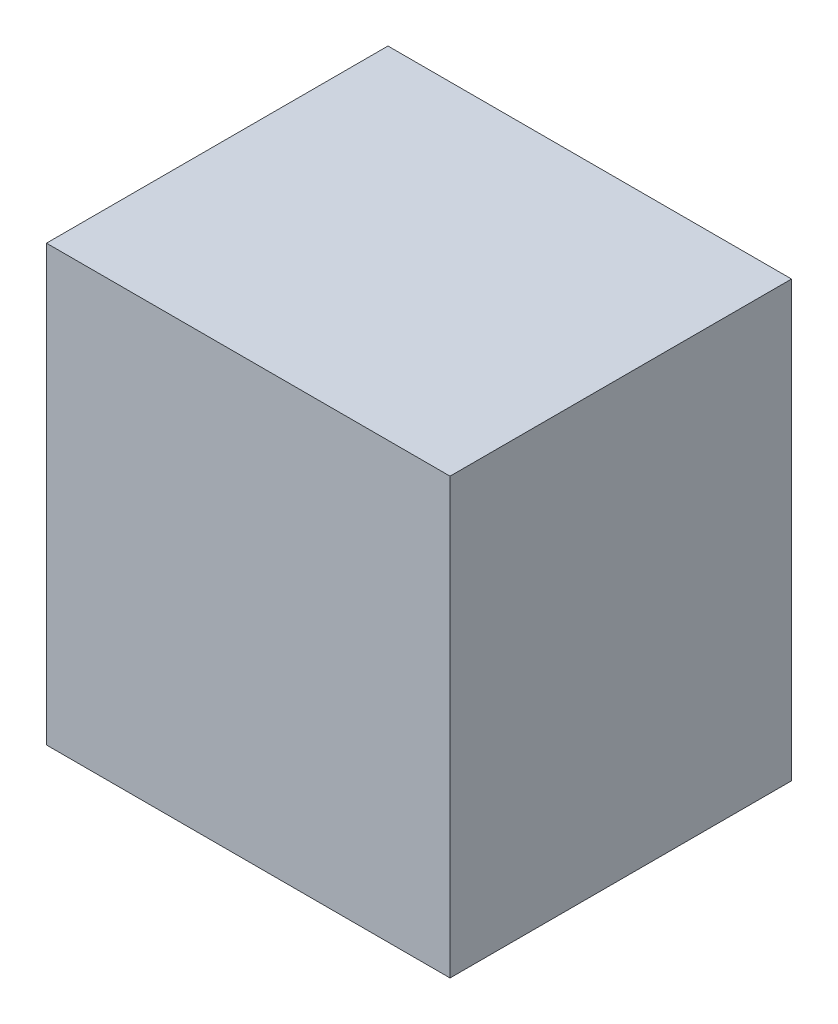
ISO-10303-21;
HEADER;
FILE_DESCRIPTION(('STEP AP214'),'2;1');
FILE_NAME('part.step','',(''),(''),'','','');
FILE_SCHEMA(('AUTOMOTIVE_DESIGN { 1 0 10303 214 1 1 1 1 }'));
ENDSEC;
DATA;
#1=APPLICATION_CONTEXT('core data for automotive mechanical design processes');
#2=APPLICATION_PROTOCOL_DEFINITION('international standard','automotive_design',2000,#1);
#3=PRODUCT_CONTEXT('',#1,'mechanical');
#4=PRODUCT('Part','Part','',(#3));
#5=PRODUCT_RELATED_PRODUCT_CATEGORY('part','',(#4));
#6=PRODUCT_DEFINITION_FORMATION('','',#4);
#7=PRODUCT_DEFINITION_CONTEXT('part definition',#1,'design');
#8=PRODUCT_DEFINITION('design','',#6,#7);
#9=PRODUCT_DEFINITION_SHAPE('','',#8);
#10=(LENGTH_UNIT() NAMED_UNIT(*) SI_UNIT(.MILLI.,.METRE.));
#11=(NAMED_UNIT(*) PLANE_ANGLE_UNIT() SI_UNIT($,.RADIAN.));
#12=(NAMED_UNIT(*) SI_UNIT($,.STERADIAN.) SOLID_ANGLE_UNIT());
#13=UNCERTAINTY_MEASURE_WITH_UNIT(LENGTH_MEASURE(1.E-05),#10,'distance_accuracy_value','');
#14=(GEOMETRIC_REPRESENTATION_CONTEXT(3) GLOBAL_UNCERTAINTY_ASSIGNED_CONTEXT((#13)) GLOBAL_UNIT_ASSIGNED_CONTEXT((#10,
#11,#12)) REPRESENTATION_CONTEXT('',''));
#15=CARTESIAN_POINT('',(0.,0.,0.));
#16=DIRECTION('',(0.,0.,1.));
#17=DIRECTION('',(1.,0.,0.));
#18=AXIS2_PLACEMENT_3D('',#15,#16,#17);
#19=CARTESIAN_POINT('',(162.5,-175.,275.));
#20=DIRECTION('',(0.,-1.,0.));
#21=DIRECTION('',(0.,0.,-1.));
#22=AXIS2_PLACEMENT_3D('',#19,#20,#21);
#23=PLANE('',#22);
#24=DIRECTION('',(-1.,0.,0.));
#25=VECTOR('',#24,1.);
#26=CARTESIAN_POINT('',(162.5,-175.,0.));
#27=LINE('',#26,#25);
#28=CARTESIAN_POINT('',(162.5,-175.,0.));
#29=VERTEX_POINT('',#28);
#30=CARTESIAN_POINT('',(-162.5,-175.,0.));
#31=VERTEX_POINT('',#30);
#32=EDGE_CURVE('E99',#29,#31,#27,.T.);
#33=ORIENTED_EDGE('',*,*,#32,.F.);
#34=DIRECTION('',(0.,0.,-1.));
#35=VECTOR('',#34,1.);
#36=CARTESIAN_POINT('',(162.5,-175.,275.));
#37=LINE('',#36,#35);
#38=CARTESIAN_POINT('',(162.5,-175.,275.));
#39=VERTEX_POINT('',#38);
#40=EDGE_CURVE('E11',#39,#29,#37,.T.);
#41=ORIENTED_EDGE('',*,*,#40,.F.);
#42=DIRECTION('',(-1.,0.,0.));
#43=VECTOR('',#42,1.);
#44=CARTESIAN_POINT('',(162.5,-175.,275.));
#45=LINE('',#44,#43);
#46=CARTESIAN_POINT('',(-162.5,-175.,275.));
#47=VERTEX_POINT('',#46);
#48=EDGE_CURVE('E93',#39,#47,#45,.T.);
#49=ORIENTED_EDGE('',*,*,#48,.T.);
#50=DIRECTION('',(0.,0.,-1.));
#51=VECTOR('',#50,1.);
#52=CARTESIAN_POINT('',(-162.5,-175.,275.));
#53=LINE('',#52,#51);
#54=EDGE_CURVE('E38',#47,#31,#53,.T.);
#55=ORIENTED_EDGE('',*,*,#54,.T.);
#56=EDGE_LOOP('',(#33,#41,#49,#55));
#57=FACE_BOUND('',#56,.T.);
#58=ADVANCED_FACE('F35',(#57),#23,.T.);
#59=CARTESIAN_POINT('',(162.5,175.,275.));
#60=DIRECTION('',(1.,0.,0.));
#61=DIRECTION('',(0.,1.,0.));
#62=AXIS2_PLACEMENT_3D('',#59,#60,#61);
#63=PLANE('',#62);
#64=DIRECTION('',(0.,-1.,0.));
#65=VECTOR('',#64,1.);
#66=CARTESIAN_POINT('',(162.5,175.,0.));
#67=LINE('',#66,#65);
#68=CARTESIAN_POINT('',(162.5,175.,0.));
#69=VERTEX_POINT('',#68);
#70=EDGE_CURVE('E95',#69,#29,#67,.T.);
#71=ORIENTED_EDGE('',*,*,#70,.F.);
#72=DIRECTION('',(0.,0.,-1.));
#73=VECTOR('',#72,1.);
#74=CARTESIAN_POINT('',(162.5,175.,275.));
#75=LINE('',#74,#73);
#76=CARTESIAN_POINT('',(162.5,175.,275.));
#77=VERTEX_POINT('',#76);
#78=EDGE_CURVE('E44',#77,#69,#75,.T.);
#79=ORIENTED_EDGE('',*,*,#78,.F.);
#80=DIRECTION('',(0.,-1.,0.));
#81=VECTOR('',#80,1.);
#82=CARTESIAN_POINT('',(162.5,175.,275.));
#83=LINE('',#82,#81);
#84=EDGE_CURVE('E90',#77,#39,#83,.T.);
#85=ORIENTED_EDGE('',*,*,#84,.T.);
#86=ORIENTED_EDGE('',*,*,#40,.T.);
#87=EDGE_LOOP('',(#71,#79,#85,#86));
#88=FACE_BOUND('',#87,.T.);
#89=ADVANCED_FACE('F109',(#88),#63,.T.);
#90=CARTESIAN_POINT('',(-162.5,175.,275.));
#91=DIRECTION('',(0.,1.,0.));
#92=DIRECTION('',(0.,0.,1.));
#93=AXIS2_PLACEMENT_3D('',#90,#91,#92);
#94=PLANE('',#93);
#95=DIRECTION('',(1.,0.,0.));
#96=VECTOR('',#95,1.);
#97=CARTESIAN_POINT('',(-162.5,175.,0.));
#98=LINE('',#97,#96);
#99=CARTESIAN_POINT('',(-162.5,175.,0.));
#100=VERTEX_POINT('',#99);
#101=EDGE_CURVE('E85',#100,#69,#98,.T.);
#102=ORIENTED_EDGE('',*,*,#101,.F.);
#103=DIRECTION('',(0.,0.,-1.));
#104=VECTOR('',#103,1.);
#105=CARTESIAN_POINT('',(-162.5,175.,275.));
#106=LINE('',#105,#104);
#107=CARTESIAN_POINT('',(-162.5,175.,275.));
#108=VERTEX_POINT('',#107);
#109=EDGE_CURVE('E80',#108,#100,#106,.T.);
#110=ORIENTED_EDGE('',*,*,#109,.F.);
#111=DIRECTION('',(1.,0.,0.));
#112=VECTOR('',#111,1.);
#113=CARTESIAN_POINT('',(-162.5,175.,275.));
#114=LINE('',#113,#112);
#115=EDGE_CURVE('E83',#108,#77,#114,.T.);
#116=ORIENTED_EDGE('',*,*,#115,.T.);
#117=ORIENTED_EDGE('',*,*,#78,.T.);
#118=EDGE_LOOP('',(#102,#110,#116,#117));
#119=FACE_BOUND('',#118,.T.);
#120=ADVANCED_FACE('F82',(#119),#94,.T.);
#121=CARTESIAN_POINT('',(-162.5,-175.,275.));
#122=DIRECTION('',(-1.,0.,0.));
#123=DIRECTION('',(0.,0.,1.));
#124=AXIS2_PLACEMENT_3D('',#121,#122,#123);
#125=PLANE('',#124);
#126=DIRECTION('',(0.,1.,0.));
#127=VECTOR('',#126,1.);
#128=CARTESIAN_POINT('',(-162.5,-175.,0.));
#129=LINE('',#128,#127);
#130=EDGE_CURVE('E102',#31,#100,#129,.T.);
#131=ORIENTED_EDGE('',*,*,#130,.F.);
#132=ORIENTED_EDGE('',*,*,#54,.F.);
#133=DIRECTION('',(0.,1.,0.));
#134=VECTOR('',#133,1.);
#135=CARTESIAN_POINT('',(-162.5,-175.,275.));
#136=LINE('',#135,#134);
#137=EDGE_CURVE('E89',#47,#108,#136,.T.);
#138=ORIENTED_EDGE('',*,*,#137,.T.);
#139=ORIENTED_EDGE('',*,*,#109,.T.);
#140=EDGE_LOOP('',(#131,#132,#138,#139));
#141=FACE_BOUND('',#140,.T.);
#142=ADVANCED_FACE('F92',(#141),#125,.T.);
#143=CARTESIAN_POINT('',(0.,0.,275.));
#144=DIRECTION('',(0.,0.,-1.));
#145=DIRECTION('',(-1.,0.,0.));
#146=AXIS2_PLACEMENT_3D('',#143,#144,#145);
#147=PLANE('',#146);
#148=ORIENTED_EDGE('',*,*,#48,.F.);
#149=ORIENTED_EDGE('',*,*,#84,.F.);
#150=ORIENTED_EDGE('',*,*,#115,.F.);
#151=ORIENTED_EDGE('',*,*,#137,.F.);
#152=EDGE_LOOP('',(#148,#149,#150,#151));
#153=FACE_BOUND('',#152,.T.);
#154=ADVANCED_FACE('F88',(#153),#147,.F.);
#155=CARTESIAN_POINT('',(0.,0.,0.));
#156=DIRECTION('',(0.,0.,-1.));
#157=DIRECTION('',(-1.,0.,0.));
#158=AXIS2_PLACEMENT_3D('',#155,#156,#157);
#159=PLANE('',#158);
#160=ORIENTED_EDGE('',*,*,#32,.T.);
#161=ORIENTED_EDGE('',*,*,#130,.T.);
#162=ORIENTED_EDGE('',*,*,#101,.T.);
#163=ORIENTED_EDGE('',*,*,#70,.T.);
#164=EDGE_LOOP('',(#160,#161,#162,#163));
#165=FACE_BOUND('',#164,.T.);
#166=ADVANCED_FACE('F108',(#165),#159,.T.);
#167=CLOSED_SHELL('',(#58,#89,#120,#142,#154,#166));
#168=MANIFOLD_SOLID_BREP('B2',#167);
#169=ADVANCED_BREP_SHAPE_REPRESENTATION('',(#18,#168),#14);
#170=SHAPE_DEFINITION_REPRESENTATION(#9,#169);
ENDSEC;
END-ISO-10303-21;
